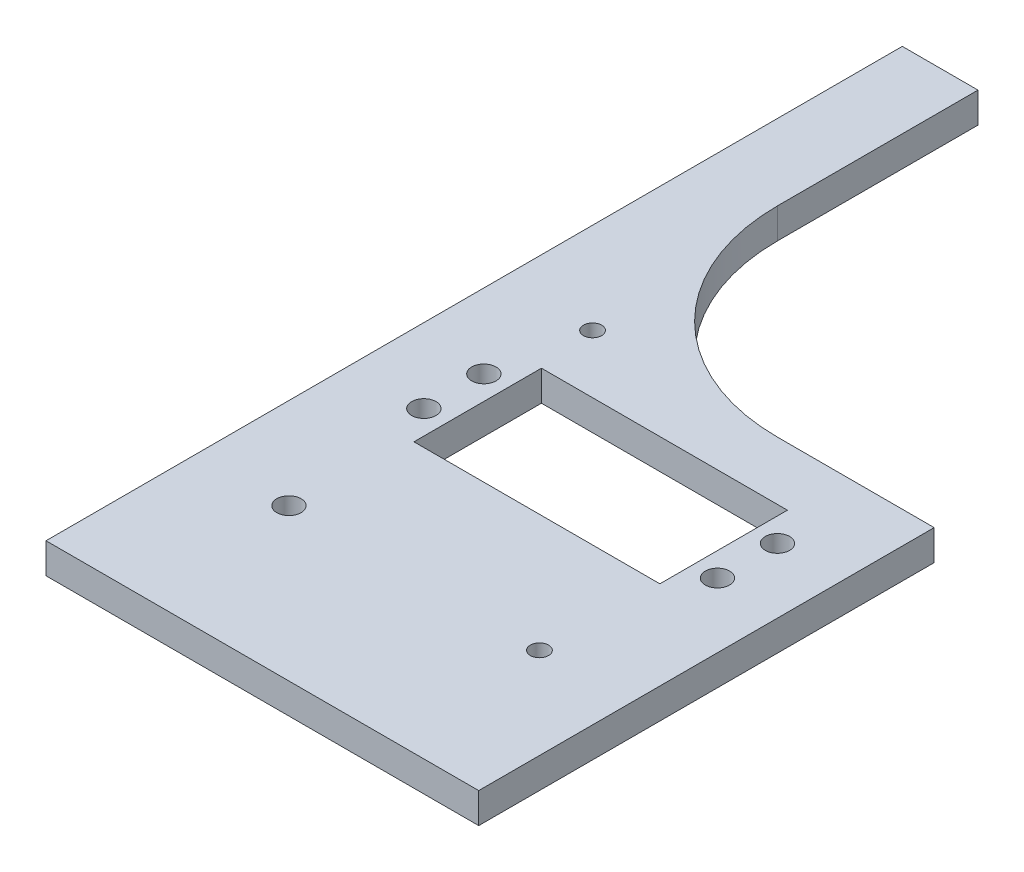
ISO-10303-21;
HEADER;
FILE_DESCRIPTION(('STEP AP214'),'2;1');
FILE_NAME('part.step','',(''),(''),'','','');
FILE_SCHEMA(('AUTOMOTIVE_DESIGN { 1 0 10303 214 1 1 1 1 }'));
ENDSEC;
DATA;
#1=APPLICATION_CONTEXT('core data for automotive mechanical design processes');
#2=APPLICATION_PROTOCOL_DEFINITION('international standard','automotive_design',2000,#1);
#3=PRODUCT_CONTEXT('',#1,'mechanical');
#4=PRODUCT('Part','Part','',(#3));
#5=PRODUCT_RELATED_PRODUCT_CATEGORY('part','',(#4));
#6=PRODUCT_DEFINITION_FORMATION('','',#4);
#7=PRODUCT_DEFINITION_CONTEXT('part definition',#1,'design');
#8=PRODUCT_DEFINITION('design','',#6,#7);
#9=PRODUCT_DEFINITION_SHAPE('','',#8);
#10=(LENGTH_UNIT() NAMED_UNIT(*) SI_UNIT(.MILLI.,.METRE.));
#11=(NAMED_UNIT(*) PLANE_ANGLE_UNIT() SI_UNIT($,.RADIAN.));
#12=(NAMED_UNIT(*) SI_UNIT($,.STERADIAN.) SOLID_ANGLE_UNIT());
#13=UNCERTAINTY_MEASURE_WITH_UNIT(LENGTH_MEASURE(1.E-05),#10,'distance_accuracy_value','');
#14=(GEOMETRIC_REPRESENTATION_CONTEXT(3) GLOBAL_UNCERTAINTY_ASSIGNED_CONTEXT((#13)) GLOBAL_UNIT_ASSIGNED_CONTEXT((#10,
#11,#12)) REPRESENTATION_CONTEXT('',''));
#15=CARTESIAN_POINT('',(0.,0.,0.));
#16=DIRECTION('',(0.,0.,1.));
#17=DIRECTION('',(1.,0.,0.));
#18=AXIS2_PLACEMENT_3D('',#15,#16,#17);
#19=CARTESIAN_POINT('',(0.,2.5,63.6));
#20=DIRECTION('',(0.,0.,1.));
#21=DIRECTION('',(1.,0.,0.));
#22=AXIS2_PLACEMENT_3D('',#19,#20,#21);
#23=PLANE('',#22);
#24=DIRECTION('',(-1.,0.,0.));
#25=VECTOR('',#24,1.);
#26=CARTESIAN_POINT('',(0.,-2.5,63.6));
#27=LINE('',#26,#25);
#28=CARTESIAN_POINT('',(11.216244138034,-2.5,63.6));
#29=VERTEX_POINT('',#28);
#30=CARTESIAN_POINT('',(-29.283755861966,-2.5,63.6));
#31=VERTEX_POINT('',#30);
#32=EDGE_CURVE('E222',#29,#31,#27,.T.);
#33=ORIENTED_EDGE('',*,*,#32,.T.);
#34=DIRECTION('',(0.,-1.,0.));
#35=VECTOR('',#34,1.);
#36=CARTESIAN_POINT('',(-29.283755861966,2.5,63.6));
#37=LINE('',#36,#35);
#38=CARTESIAN_POINT('',(-29.283755861966,2.5,63.6));
#39=VERTEX_POINT('',#38);
#40=EDGE_CURVE('E11',#39,#31,#37,.T.);
#41=ORIENTED_EDGE('',*,*,#40,.F.);
#42=DIRECTION('',(-1.,0.,0.));
#43=VECTOR('',#42,1.);
#44=CARTESIAN_POINT('',(0.,2.5,63.6));
#45=LINE('',#44,#43);
#46=CARTESIAN_POINT('',(11.216244138034,2.5,63.6));
#47=VERTEX_POINT('',#46);
#48=EDGE_CURVE('E155',#47,#39,#45,.T.);
#49=ORIENTED_EDGE('',*,*,#48,.F.);
#50=DIRECTION('',(0.,-1.,0.));
#51=VECTOR('',#50,1.);
#52=CARTESIAN_POINT('',(11.216244138034,2.5,63.6));
#53=LINE('',#52,#51);
#54=EDGE_CURVE('E261',#47,#29,#53,.T.);
#55=ORIENTED_EDGE('',*,*,#54,.T.);
#56=EDGE_LOOP('',(#33,#41,#49,#55));
#57=FACE_BOUND('',#56,.T.);
#58=ADVANCED_FACE('F47',(#57),#23,.F.);
#59=CARTESIAN_POINT('',(-29.283755861966,2.5,0.));
#60=DIRECTION('',(1.,0.,0.));
#61=DIRECTION('',(0.,0.,-1.));
#62=AXIS2_PLACEMENT_3D('',#59,#60,#61);
#63=PLANE('',#62);
#64=DIRECTION('',(0.,0.,1.));
#65=VECTOR('',#64,1.);
#66=CARTESIAN_POINT('',(-29.283755861966,-2.5,0.));
#67=LINE('',#66,#65);
#68=CARTESIAN_POINT('',(-29.283755861966,-2.5,42.6));
#69=VERTEX_POINT('',#68);
#70=EDGE_CURVE('E144',#69,#31,#67,.T.);
#71=ORIENTED_EDGE('',*,*,#70,.F.);
#72=DIRECTION('',(0.,-1.,0.));
#73=VECTOR('',#72,1.);
#74=CARTESIAN_POINT('',(-29.283755861966,2.5,42.6));
#75=LINE('',#74,#73);
#76=CARTESIAN_POINT('',(-29.283755861966,2.5,42.6));
#77=VERTEX_POINT('',#76);
#78=EDGE_CURVE('E58',#77,#69,#75,.T.);
#79=ORIENTED_EDGE('',*,*,#78,.F.);
#80=DIRECTION('',(0.,0.,1.));
#81=VECTOR('',#80,1.);
#82=CARTESIAN_POINT('',(-29.283755861966,2.5,0.));
#83=LINE('',#82,#81);
#84=EDGE_CURVE('E142',#77,#39,#83,.T.);
#85=ORIENTED_EDGE('',*,*,#84,.T.);
#86=ORIENTED_EDGE('',*,*,#40,.T.);
#87=EDGE_LOOP('',(#71,#79,#85,#86));
#88=FACE_BOUND('',#87,.T.);
#89=ADVANCED_FACE('F141',(#88),#63,.T.);
#90=CARTESIAN_POINT('',(0.,2.5,42.6));
#91=DIRECTION('',(0.,0.,1.));
#92=DIRECTION('',(1.,0.,0.));
#93=AXIS2_PLACEMENT_3D('',#90,#91,#92);
#94=PLANE('',#93);
#95=DIRECTION('',(-1.,0.,0.));
#96=VECTOR('',#95,1.);
#97=CARTESIAN_POINT('',(0.,-2.5,42.6));
#98=LINE('',#97,#96);
#99=CARTESIAN_POINT('',(11.216244138034,-2.5,42.6));
#100=VERTEX_POINT('',#99);
#101=EDGE_CURVE('E228',#100,#69,#98,.T.);
#102=ORIENTED_EDGE('',*,*,#101,.F.);
#103=DIRECTION('',(0.,-1.,0.));
#104=VECTOR('',#103,1.);
#105=CARTESIAN_POINT('',(11.216244138034,2.5,42.6));
#106=LINE('',#105,#104);
#107=CARTESIAN_POINT('',(11.216244138034,2.5,42.6));
#108=VERTEX_POINT('',#107);
#109=EDGE_CURVE('E103',#108,#100,#106,.T.);
#110=ORIENTED_EDGE('',*,*,#109,.F.);
#111=DIRECTION('',(-1.,0.,0.));
#112=VECTOR('',#111,1.);
#113=CARTESIAN_POINT('',(0.,2.5,42.6));
#114=LINE('',#113,#112);
#115=EDGE_CURVE('E153',#108,#77,#114,.T.);
#116=ORIENTED_EDGE('',*,*,#115,.T.);
#117=ORIENTED_EDGE('',*,*,#78,.T.);
#118=EDGE_LOOP('',(#102,#110,#116,#117));
#119=FACE_BOUND('',#118,.T.);
#120=ADVANCED_FACE('F159',(#119),#94,.T.);
#121=CARTESIAN_POINT('',(0.,2.5,107.999697870866));
#122=DIRECTION('',(0.,0.,-1.));
#123=DIRECTION('',(-1.,0.,0.));
#124=AXIS2_PLACEMENT_3D('',#121,#122,#123);
#125=PLANE('',#124);
#126=DIRECTION('',(1.,0.,0.));
#127=VECTOR('',#126,1.);
#128=CARTESIAN_POINT('',(0.,-2.5,107.999697870866));
#129=LINE('',#128,#127);
#130=CARTESIAN_POINT('',(-45.4667335164913,-2.5,107.999697870866));
#131=VERTEX_POINT('',#130);
#132=CARTESIAN_POINT('',(25.786244138034,-2.5,107.999697870866));
#133=VERTEX_POINT('',#132);
#134=EDGE_CURVE('E195',#131,#133,#129,.T.);
#135=ORIENTED_EDGE('',*,*,#134,.T.);
#136=DIRECTION('',(0.,-1.,0.));
#137=VECTOR('',#136,1.);
#138=CARTESIAN_POINT('',(25.786244138034,2.5,107.999697870866));
#139=LINE('',#138,#137);
#140=CARTESIAN_POINT('',(25.786244138034,2.5,107.999697870866));
#141=VERTEX_POINT('',#140);
#142=EDGE_CURVE('E51',#141,#133,#139,.T.);
#143=ORIENTED_EDGE('',*,*,#142,.F.);
#144=DIRECTION('',(1.,0.,0.));
#145=VECTOR('',#144,1.);
#146=CARTESIAN_POINT('',(0.,2.5,107.999697870866));
#147=LINE('',#146,#145);
#148=CARTESIAN_POINT('',(-45.4667335164913,2.5,107.999697870866));
#149=VERTEX_POINT('',#148);
#150=EDGE_CURVE('E115',#149,#141,#147,.T.);
#151=ORIENTED_EDGE('',*,*,#150,.F.);
#152=DIRECTION('',(0.,-1.,0.));
#153=VECTOR('',#152,1.);
#154=CARTESIAN_POINT('',(-45.4667335164913,2.5,107.999697870866));
#155=LINE('',#154,#153);
#156=EDGE_CURVE('E194',#149,#131,#155,.T.);
#157=ORIENTED_EDGE('',*,*,#156,.T.);
#158=EDGE_LOOP('',(#135,#143,#151,#157));
#159=FACE_BOUND('',#158,.T.);
#160=ADVANCED_FACE('F49',(#159),#125,.F.);
#161=CARTESIAN_POINT('',(25.786244138034,2.5,0.));
#162=DIRECTION('',(1.,0.,0.));
#163=DIRECTION('',(0.,0.,-1.));
#164=AXIS2_PLACEMENT_3D('',#161,#162,#163);
#165=PLANE('',#164);
#166=DIRECTION('',(0.,0.,1.));
#167=VECTOR('',#166,1.);
#168=CARTESIAN_POINT('',(25.786244138034,-2.5,0.));
#169=LINE('',#168,#167);
#170=CARTESIAN_POINT('',(25.786244138034,-2.5,33.));
#171=VERTEX_POINT('',#170);
#172=EDGE_CURVE('E199',#171,#133,#169,.T.);
#173=ORIENTED_EDGE('',*,*,#172,.F.);
#174=DIRECTION('',(0.,-1.,0.));
#175=VECTOR('',#174,1.);
#176=CARTESIAN_POINT('',(25.786244138034,2.5,33.));
#177=LINE('',#176,#175);
#178=CARTESIAN_POINT('',(25.786244138034,2.5,33.));
#179=VERTEX_POINT('',#178);
#180=EDGE_CURVE('E280',#179,#171,#177,.T.);
#181=ORIENTED_EDGE('',*,*,#180,.F.);
#182=DIRECTION('',(0.,0.,1.));
#183=VECTOR('',#182,1.);
#184=CARTESIAN_POINT('',(25.786244138034,2.5,0.));
#185=LINE('',#184,#183);
#186=EDGE_CURVE('E290',#179,#141,#185,.T.);
#187=ORIENTED_EDGE('',*,*,#186,.T.);
#188=ORIENTED_EDGE('',*,*,#142,.T.);
#189=EDGE_LOOP('',(#173,#181,#187,#188));
#190=FACE_BOUND('',#189,.T.);
#191=ADVANCED_FACE('F289',(#190),#165,.T.);
#192=CARTESIAN_POINT('',(0.,2.5,33.));
#193=DIRECTION('',(0.,0.,-1.));
#194=DIRECTION('',(-1.,0.,0.));
#195=AXIS2_PLACEMENT_3D('',#192,#193,#194);
#196=PLANE('',#195);
#197=DIRECTION('',(1.,0.,0.));
#198=VECTOR('',#197,1.);
#199=CARTESIAN_POINT('',(0.,-2.5,33.));
#200=LINE('',#199,#198);
#201=CARTESIAN_POINT('',(0.,-2.5,33.));
#202=VERTEX_POINT('',#201);
#203=EDGE_CURVE('E203',#202,#171,#200,.T.);
#204=ORIENTED_EDGE('',*,*,#203,.F.);
#205=DIRECTION('',(0.,-1.,0.));
#206=VECTOR('',#205,1.);
#207=CARTESIAN_POINT('',(0.,2.5,33.));
#208=LINE('',#207,#206);
#209=CARTESIAN_POINT('',(0.,2.5,33.));
#210=VERTEX_POINT('',#209);
#211=EDGE_CURVE('E278',#210,#202,#208,.T.);
#212=ORIENTED_EDGE('',*,*,#211,.F.);
#213=DIRECTION('',(1.,0.,0.));
#214=VECTOR('',#213,1.);
#215=CARTESIAN_POINT('',(0.,2.5,33.));
#216=LINE('',#215,#214);
#217=EDGE_CURVE('E301',#210,#179,#216,.T.);
#218=ORIENTED_EDGE('',*,*,#217,.T.);
#219=ORIENTED_EDGE('',*,*,#180,.T.);
#220=EDGE_LOOP('',(#204,#212,#218,#219));
#221=FACE_BOUND('',#220,.T.);
#222=ADVANCED_FACE('F299',(#221),#196,.T.);
#223=CARTESIAN_POINT('',(0.,2.5,0.));
#224=DIRECTION('',(0.,-1.,0.));
#225=DIRECTION('',(0.,0.,-1.));
#226=AXIS2_PLACEMENT_3D('',#223,#224,#225);
#227=CYLINDRICAL_SURFACE('',#226,33.);
#228=CARTESIAN_POINT('',(0.,-2.5,0.));
#229=DIRECTION('',(0.,1.,0.));
#230=DIRECTION('',(0.,0.,1.));
#231=AXIS2_PLACEMENT_3D('',#228,#229,#230);
#232=CIRCLE('',#231,33.);
#233=CARTESIAN_POINT('',(-33.,-2.5,0.));
#234=VERTEX_POINT('',#233);
#235=EDGE_CURVE('E207',#234,#202,#232,.T.);
#236=ORIENTED_EDGE('',*,*,#235,.F.);
#237=DIRECTION('',(0.,-1.,0.));
#238=VECTOR('',#237,1.);
#239=CARTESIAN_POINT('',(-33.,2.5,0.));
#240=LINE('',#239,#238);
#241=CARTESIAN_POINT('',(-33.,2.5,0.));
#242=VERTEX_POINT('',#241);
#243=EDGE_CURVE('E275',#242,#234,#240,.T.);
#244=ORIENTED_EDGE('',*,*,#243,.F.);
#245=CARTESIAN_POINT('',(0.,2.5,0.));
#246=DIRECTION('',(0.,1.,0.));
#247=DIRECTION('',(0.,0.,1.));
#248=AXIS2_PLACEMENT_3D('',#245,#246,#247);
#249=CIRCLE('',#248,33.);
#250=EDGE_CURVE('E305',#242,#210,#249,.T.);
#251=ORIENTED_EDGE('',*,*,#250,.T.);
#252=ORIENTED_EDGE('',*,*,#211,.T.);
#253=EDGE_LOOP('',(#236,#244,#251,#252));
#254=FACE_BOUND('',#253,.T.);
#255=ADVANCED_FACE('F308',(#254),#227,.F.);
#256=CARTESIAN_POINT('',(-33.,2.5,0.));
#257=DIRECTION('',(-1.,0.,0.));
#258=DIRECTION('',(0.,0.,1.));
#259=AXIS2_PLACEMENT_3D('',#256,#257,#258);
#260=PLANE('',#259);
#261=DIRECTION('',(0.,0.,-1.));
#262=VECTOR('',#261,1.);
#263=CARTESIAN_POINT('',(-33.,-2.5,0.));
#264=LINE('',#263,#262);
#265=CARTESIAN_POINT('',(-33.,-2.5,-33.));
#266=VERTEX_POINT('',#265);
#267=EDGE_CURVE('E211',#234,#266,#264,.T.);
#268=ORIENTED_EDGE('',*,*,#267,.T.);
#269=DIRECTION('',(0.,-1.,0.));
#270=VECTOR('',#269,1.);
#271=CARTESIAN_POINT('',(-33.,2.5,-33.));
#272=LINE('',#271,#270);
#273=CARTESIAN_POINT('',(-33.,2.5,-33.));
#274=VERTEX_POINT('',#273);
#275=EDGE_CURVE('E271',#274,#266,#272,.T.);
#276=ORIENTED_EDGE('',*,*,#275,.F.);
#277=DIRECTION('',(0.,0.,-1.));
#278=VECTOR('',#277,1.);
#279=CARTESIAN_POINT('',(-33.,2.5,0.));
#280=LINE('',#279,#278);
#281=EDGE_CURVE('E311',#242,#274,#280,.T.);
#282=ORIENTED_EDGE('',*,*,#281,.F.);
#283=ORIENTED_EDGE('',*,*,#243,.T.);
#284=EDGE_LOOP('',(#268,#276,#282,#283));
#285=FACE_BOUND('',#284,.T.);
#286=ADVANCED_FACE('F333',(#285),#260,.F.);
#287=CARTESIAN_POINT('',(0.,2.5,-33.));
#288=DIRECTION('',(0.,0.,1.));
#289=DIRECTION('',(1.,0.,0.));
#290=AXIS2_PLACEMENT_3D('',#287,#288,#289);
#291=PLANE('',#290);
#292=DIRECTION('',(-1.,0.,0.));
#293=VECTOR('',#292,1.);
#294=CARTESIAN_POINT('',(0.,-2.5,-33.));
#295=LINE('',#294,#293);
#296=CARTESIAN_POINT('',(-45.4667335164913,-2.5,-33.));
#297=VERTEX_POINT('',#296);
#298=EDGE_CURVE('E214',#266,#297,#295,.T.);
#299=ORIENTED_EDGE('',*,*,#298,.T.);
#300=DIRECTION('',(0.,-1.,0.));
#301=VECTOR('',#300,1.);
#302=CARTESIAN_POINT('',(-45.4667335164913,2.5,-33.));
#303=LINE('',#302,#301);
#304=CARTESIAN_POINT('',(-45.4667335164913,2.5,-33.));
#305=VERTEX_POINT('',#304);
#306=EDGE_CURVE('E268',#305,#297,#303,.T.);
#307=ORIENTED_EDGE('',*,*,#306,.F.);
#308=DIRECTION('',(-1.,0.,0.));
#309=VECTOR('',#308,1.);
#310=CARTESIAN_POINT('',(0.,2.5,-33.));
#311=LINE('',#310,#309);
#312=EDGE_CURVE('E314',#274,#305,#311,.T.);
#313=ORIENTED_EDGE('',*,*,#312,.F.);
#314=ORIENTED_EDGE('',*,*,#275,.T.);
#315=EDGE_LOOP('',(#299,#307,#313,#314));
#316=FACE_BOUND('',#315,.T.);
#317=ADVANCED_FACE('F330',(#316),#291,.F.);
#318=CARTESIAN_POINT('',(15.136244138034,2.5,48.16));
#319=DIRECTION('',(0.,-1.,0.));
#320=DIRECTION('',(0.,0.,-1.));
#321=AXIS2_PLACEMENT_3D('',#318,#319,#320);
#322=CYLINDRICAL_SURFACE('',#321,2.00000000000001);
#323=CARTESIAN_POINT('',(15.136244138034,2.5,48.16));
#324=DIRECTION('',(0.,1.,0.));
#325=DIRECTION('',(0.,0.,1.));
#326=AXIS2_PLACEMENT_3D('',#323,#324,#325);
#327=CIRCLE('',#326,2.00000000000001);
#328=CARTESIAN_POINT('',(15.136244138034,2.5,50.16));
#329=VERTEX_POINT('',#328);
#330=EDGE_CURVE('E186',#329,#329,#327,.T.);
#331=ORIENTED_EDGE('',*,*,#330,.T.);
#332=EDGE_LOOP('',(#331));
#333=FACE_BOUND('',#332,.T.);
#334=CARTESIAN_POINT('',(15.136244138034,-2.5,48.16));
#335=DIRECTION('',(0.,1.,0.));
#336=DIRECTION('',(0.,0.,1.));
#337=AXIS2_PLACEMENT_3D('',#334,#335,#336);
#338=CIRCLE('',#337,2.00000000000001);
#339=CARTESIAN_POINT('',(15.136244138034,-2.5,50.16));
#340=VERTEX_POINT('',#339);
#341=EDGE_CURVE('E253',#340,#340,#338,.T.);
#342=ORIENTED_EDGE('',*,*,#341,.F.);
#343=EDGE_LOOP('',(#342));
#344=FACE_BOUND('',#343,.T.);
#345=ADVANCED_FACE('F340',(#333,#344),#322,.F.);
#346=CARTESIAN_POINT('',(15.136244138034,2.5,58.04));
#347=DIRECTION('',(0.,-1.,0.));
#348=DIRECTION('',(0.,0.,-1.));
#349=AXIS2_PLACEMENT_3D('',#346,#347,#348);
#350=CYLINDRICAL_SURFACE('',#349,2.);
#351=CARTESIAN_POINT('',(15.136244138034,2.5,58.04));
#352=DIRECTION('',(0.,1.,0.));
#353=DIRECTION('',(0.,0.,1.));
#354=AXIS2_PLACEMENT_3D('',#351,#352,#353);
#355=CIRCLE('',#354,2.);
#356=CARTESIAN_POINT('',(15.136244138034,2.5,60.04));
#357=VERTEX_POINT('',#356);
#358=EDGE_CURVE('E182',#357,#357,#355,.T.);
#359=ORIENTED_EDGE('',*,*,#358,.T.);
#360=EDGE_LOOP('',(#359));
#361=FACE_BOUND('',#360,.T.);
#362=CARTESIAN_POINT('',(15.136244138034,-2.5,58.04));
#363=DIRECTION('',(0.,1.,0.));
#364=DIRECTION('',(0.,0.,1.));
#365=AXIS2_PLACEMENT_3D('',#362,#363,#364);
#366=CIRCLE('',#365,2.);
#367=CARTESIAN_POINT('',(15.136244138034,-2.5,60.04));
#368=VERTEX_POINT('',#367);
#369=EDGE_CURVE('E249',#368,#368,#366,.T.);
#370=ORIENTED_EDGE('',*,*,#369,.F.);
#371=EDGE_LOOP('',(#370));
#372=FACE_BOUND('',#371,.T.);
#373=ADVANCED_FACE('F409',(#361,#372),#350,.F.);
#374=CARTESIAN_POINT('',(10.786244138034,2.5,83.));
#375=DIRECTION('',(0.,-1.,0.));
#376=DIRECTION('',(0.,0.,-1.));
#377=AXIS2_PLACEMENT_3D('',#374,#375,#376);
#378=CYLINDRICAL_SURFACE('',#377,1.5);
#379=CARTESIAN_POINT('',(10.786244138034,2.5,83.));
#380=DIRECTION('',(0.,1.,0.));
#381=DIRECTION('',(0.,0.,1.));
#382=AXIS2_PLACEMENT_3D('',#379,#380,#381);
#383=CIRCLE('',#382,1.5);
#384=CARTESIAN_POINT('',(10.786244138034,2.5,84.5));
#385=VERTEX_POINT('',#384);
#386=EDGE_CURVE('E178',#385,#385,#383,.T.);
#387=ORIENTED_EDGE('',*,*,#386,.T.);
#388=EDGE_LOOP('',(#387));
#389=FACE_BOUND('',#388,.T.);
#390=CARTESIAN_POINT('',(10.786244138034,-2.5,83.));
#391=DIRECTION('',(0.,1.,0.));
#392=DIRECTION('',(0.,0.,1.));
#393=AXIS2_PLACEMENT_3D('',#390,#391,#392);
#394=CIRCLE('',#393,1.5);
#395=CARTESIAN_POINT('',(10.786244138034,-2.5,84.5));
#396=VERTEX_POINT('',#395);
#397=EDGE_CURVE('E245',#396,#396,#394,.T.);
#398=ORIENTED_EDGE('',*,*,#397,.F.);
#399=EDGE_LOOP('',(#398));
#400=FACE_BOUND('',#399,.T.);
#401=ADVANCED_FACE('F420',(#389,#400),#378,.F.);
#402=CARTESIAN_POINT('',(-30.463755861966,2.5,83.));
#403=DIRECTION('',(0.,-1.,0.));
#404=DIRECTION('',(0.,0.,-1.));
#405=AXIS2_PLACEMENT_3D('',#402,#403,#404);
#406=CYLINDRICAL_SURFACE('',#405,2.);
#407=CARTESIAN_POINT('',(-30.463755861966,2.5,83.));
#408=DIRECTION('',(0.,1.,0.));
#409=DIRECTION('',(0.,0.,1.));
#410=AXIS2_PLACEMENT_3D('',#407,#408,#409);
#411=CIRCLE('',#410,2.);
#412=CARTESIAN_POINT('',(-30.463755861966,2.5,85.));
#413=VERTEX_POINT('',#412);
#414=EDGE_CURVE('E174',#413,#413,#411,.T.);
#415=ORIENTED_EDGE('',*,*,#414,.T.);
#416=EDGE_LOOP('',(#415));
#417=FACE_BOUND('',#416,.T.);
#418=CARTESIAN_POINT('',(-30.463755861966,-2.5,83.));
#419=DIRECTION('',(0.,1.,0.));
#420=DIRECTION('',(0.,0.,1.));
#421=AXIS2_PLACEMENT_3D('',#418,#419,#420);
#422=CIRCLE('',#421,2.);
#423=CARTESIAN_POINT('',(-30.463755861966,-2.5,85.));
#424=VERTEX_POINT('',#423);
#425=EDGE_CURVE('E241',#424,#424,#422,.T.);
#426=ORIENTED_EDGE('',*,*,#425,.F.);
#427=EDGE_LOOP('',(#426));
#428=FACE_BOUND('',#427,.T.);
#429=ADVANCED_FACE('F431',(#417,#428),#406,.F.);
#430=CARTESIAN_POINT('',(-30.4667335164913,2.5,33.));
#431=DIRECTION('',(0.,-1.,0.));
#432=DIRECTION('',(0.,0.,-1.));
#433=AXIS2_PLACEMENT_3D('',#430,#431,#432);
#434=CYLINDRICAL_SURFACE('',#433,1.5);
#435=CARTESIAN_POINT('',(-30.4667335164913,2.5,33.));
#436=DIRECTION('',(0.,1.,0.));
#437=DIRECTION('',(0.,0.,1.));
#438=AXIS2_PLACEMENT_3D('',#435,#436,#437);
#439=CIRCLE('',#438,1.5);
#440=CARTESIAN_POINT('',(-30.4667335164913,2.5,34.5));
#441=VERTEX_POINT('',#440);
#442=EDGE_CURVE('E170',#441,#441,#439,.T.);
#443=ORIENTED_EDGE('',*,*,#442,.T.);
#444=EDGE_LOOP('',(#443));
#445=FACE_BOUND('',#444,.T.);
#446=CARTESIAN_POINT('',(-30.4667335164913,-2.5,33.));
#447=DIRECTION('',(0.,1.,0.));
#448=DIRECTION('',(0.,0.,1.));
#449=AXIS2_PLACEMENT_3D('',#446,#447,#448);
#450=CIRCLE('',#449,1.5);
#451=CARTESIAN_POINT('',(-30.4667335164913,-2.5,34.5));
#452=VERTEX_POINT('',#451);
#453=EDGE_CURVE('E237',#452,#452,#450,.T.);
#454=ORIENTED_EDGE('',*,*,#453,.F.);
#455=EDGE_LOOP('',(#454));
#456=FACE_BOUND('',#455,.T.);
#457=ADVANCED_FACE('F366',(#445,#456),#434,.F.);
#458=CARTESIAN_POINT('',(-33.2067335164913,2.5,48.16));
#459=DIRECTION('',(0.,-1.,0.));
#460=DIRECTION('',(0.,0.,-1.));
#461=AXIS2_PLACEMENT_3D('',#458,#459,#460);
#462=CYLINDRICAL_SURFACE('',#461,2.);
#463=CARTESIAN_POINT('',(-33.2067335164913,2.5,48.16));
#464=DIRECTION('',(0.,1.,0.));
#465=DIRECTION('',(0.,0.,1.));
#466=AXIS2_PLACEMENT_3D('',#463,#464,#465);
#467=CIRCLE('',#466,2.);
#468=CARTESIAN_POINT('',(-33.2067335164913,2.5,50.16));
#469=VERTEX_POINT('',#468);
#470=EDGE_CURVE('E163',#469,#469,#467,.T.);
#471=ORIENTED_EDGE('',*,*,#470,.T.);
#472=EDGE_LOOP('',(#471));
#473=FACE_BOUND('',#472,.T.);
#474=CARTESIAN_POINT('',(-33.2067335164913,-2.5,48.16));
#475=DIRECTION('',(0.,1.,0.));
#476=DIRECTION('',(0.,0.,1.));
#477=AXIS2_PLACEMENT_3D('',#474,#475,#476);
#478=CIRCLE('',#477,2.);
#479=CARTESIAN_POINT('',(-33.2067335164913,-2.5,50.16));
#480=VERTEX_POINT('',#479);
#481=EDGE_CURVE('E233',#480,#480,#478,.T.);
#482=ORIENTED_EDGE('',*,*,#481,.F.);
#483=EDGE_LOOP('',(#482));
#484=FACE_BOUND('',#483,.T.);
#485=ADVANCED_FACE('F361',(#473,#484),#462,.F.);
#486=CARTESIAN_POINT('',(11.216244138034,2.5,0.));
#487=DIRECTION('',(1.,0.,0.));
#488=DIRECTION('',(0.,0.,-1.));
#489=AXIS2_PLACEMENT_3D('',#486,#487,#488);
#490=PLANE('',#489);
#491=DIRECTION('',(0.,0.,1.));
#492=VECTOR('',#491,1.);
#493=CARTESIAN_POINT('',(11.216244138034,-2.5,0.));
#494=LINE('',#493,#492);
#495=EDGE_CURVE('E106',#100,#29,#494,.T.);
#496=ORIENTED_EDGE('',*,*,#495,.T.);
#497=ORIENTED_EDGE('',*,*,#54,.F.);
#498=DIRECTION('',(0.,0.,1.));
#499=VECTOR('',#498,1.);
#500=CARTESIAN_POINT('',(11.216244138034,2.5,0.));
#501=LINE('',#500,#499);
#502=EDGE_CURVE('E67',#108,#47,#501,.T.);
#503=ORIENTED_EDGE('',*,*,#502,.F.);
#504=ORIENTED_EDGE('',*,*,#109,.T.);
#505=EDGE_LOOP('',(#496,#497,#503,#504));
#506=FACE_BOUND('',#505,.T.);
#507=ADVANCED_FACE('F354',(#506),#490,.F.);
#508=CARTESIAN_POINT('',(-45.4667335164913,2.5,0.));
#509=DIRECTION('',(-1.,0.,0.));
#510=DIRECTION('',(0.,0.,1.));
#511=AXIS2_PLACEMENT_3D('',#508,#509,#510);
#512=PLANE('',#511);
#513=DIRECTION('',(0.,0.,-1.));
#514=VECTOR('',#513,1.);
#515=CARTESIAN_POINT('',(-45.4667335164913,-2.5,0.));
#516=LINE('',#515,#514);
#517=EDGE_CURVE('E218',#131,#297,#516,.T.);
#518=ORIENTED_EDGE('',*,*,#517,.F.);
#519=ORIENTED_EDGE('',*,*,#156,.F.);
#520=DIRECTION('',(0.,0.,-1.));
#521=VECTOR('',#520,1.);
#522=CARTESIAN_POINT('',(-45.4667335164913,2.5,0.));
#523=LINE('',#522,#521);
#524=EDGE_CURVE('E320',#149,#305,#523,.T.);
#525=ORIENTED_EDGE('',*,*,#524,.T.);
#526=ORIENTED_EDGE('',*,*,#306,.T.);
#527=EDGE_LOOP('',(#518,#519,#525,#526));
#528=FACE_BOUND('',#527,.T.);
#529=ADVANCED_FACE('F325',(#528),#512,.T.);
#530=CARTESIAN_POINT('',(-33.2067335164913,2.5,58.04));
#531=DIRECTION('',(0.,-1.,0.));
#532=DIRECTION('',(0.,0.,-1.));
#533=AXIS2_PLACEMENT_3D('',#530,#531,#532);
#534=CYLINDRICAL_SURFACE('',#533,2.);
#535=CARTESIAN_POINT('',(-33.2067335164913,2.5,58.04));
#536=DIRECTION('',(0.,1.,0.));
#537=DIRECTION('',(0.,0.,1.));
#538=AXIS2_PLACEMENT_3D('',#535,#536,#537);
#539=CIRCLE('',#538,2.);
#540=CARTESIAN_POINT('',(-33.2067335164913,2.5,60.04));
#541=VERTEX_POINT('',#540);
#542=EDGE_CURVE('E190',#541,#541,#539,.T.);
#543=ORIENTED_EDGE('',*,*,#542,.T.);
#544=EDGE_LOOP('',(#543));
#545=FACE_BOUND('',#544,.T.);
#546=CARTESIAN_POINT('',(-33.2067335164913,-2.5,58.04));
#547=DIRECTION('',(0.,1.,0.));
#548=DIRECTION('',(0.,0.,1.));
#549=AXIS2_PLACEMENT_3D('',#546,#547,#548);
#550=CIRCLE('',#549,2.);
#551=CARTESIAN_POINT('',(-33.2067335164913,-2.5,60.04));
#552=VERTEX_POINT('',#551);
#553=EDGE_CURVE('E257',#552,#552,#550,.T.);
#554=ORIENTED_EDGE('',*,*,#553,.F.);
#555=EDGE_LOOP('',(#554));
#556=FACE_BOUND('',#555,.T.);
#557=ADVANCED_FACE('F353',(#545,#556),#534,.F.);
#558=CARTESIAN_POINT('',(0.,2.5,0.));
#559=DIRECTION('',(0.,1.,0.));
#560=DIRECTION('',(0.,0.,1.));
#561=AXIS2_PLACEMENT_3D('',#558,#559,#560);
#562=PLANE('',#561);
#563=ORIENTED_EDGE('',*,*,#150,.T.);
#564=ORIENTED_EDGE('',*,*,#186,.F.);
#565=ORIENTED_EDGE('',*,*,#217,.F.);
#566=ORIENTED_EDGE('',*,*,#250,.F.);
#567=ORIENTED_EDGE('',*,*,#281,.T.);
#568=ORIENTED_EDGE('',*,*,#312,.T.);
#569=ORIENTED_EDGE('',*,*,#524,.F.);
#570=EDGE_LOOP('',(#563,#564,#565,#566,#567,#568,#569));
#571=FACE_BOUND('',#570,.T.);
#572=ORIENTED_EDGE('',*,*,#48,.T.);
#573=ORIENTED_EDGE('',*,*,#84,.F.);
#574=ORIENTED_EDGE('',*,*,#115,.F.);
#575=ORIENTED_EDGE('',*,*,#502,.T.);
#576=EDGE_LOOP('',(#572,#573,#574,#575));
#577=FACE_BOUND('',#576,.T.);
#578=ORIENTED_EDGE('',*,*,#470,.F.);
#579=EDGE_LOOP('',(#578));
#580=FACE_BOUND('',#579,.T.);
#581=ORIENTED_EDGE('',*,*,#442,.F.);
#582=EDGE_LOOP('',(#581));
#583=FACE_BOUND('',#582,.T.);
#584=ORIENTED_EDGE('',*,*,#414,.F.);
#585=EDGE_LOOP('',(#584));
#586=FACE_BOUND('',#585,.T.);
#587=ORIENTED_EDGE('',*,*,#386,.F.);
#588=EDGE_LOOP('',(#587));
#589=FACE_BOUND('',#588,.T.);
#590=ORIENTED_EDGE('',*,*,#358,.F.);
#591=EDGE_LOOP('',(#590));
#592=FACE_BOUND('',#591,.T.);
#593=ORIENTED_EDGE('',*,*,#330,.F.);
#594=EDGE_LOOP('',(#593));
#595=FACE_BOUND('',#594,.T.);
#596=ORIENTED_EDGE('',*,*,#542,.F.);
#597=EDGE_LOOP('',(#596));
#598=FACE_BOUND('',#597,.T.);
#599=ADVANCED_FACE('F151',(#571,#577,#580,#583,#586,#589,#592,#595,#598),#562,.T.);
#600=CARTESIAN_POINT('',(0.,-2.5,0.));
#601=DIRECTION('',(0.,1.,0.));
#602=DIRECTION('',(0.,0.,1.));
#603=AXIS2_PLACEMENT_3D('',#600,#601,#602);
#604=PLANE('',#603);
#605=ORIENTED_EDGE('',*,*,#134,.F.);
#606=ORIENTED_EDGE('',*,*,#517,.T.);
#607=ORIENTED_EDGE('',*,*,#298,.F.);
#608=ORIENTED_EDGE('',*,*,#267,.F.);
#609=ORIENTED_EDGE('',*,*,#235,.T.);
#610=ORIENTED_EDGE('',*,*,#203,.T.);
#611=ORIENTED_EDGE('',*,*,#172,.T.);
#612=EDGE_LOOP('',(#605,#606,#607,#608,#609,#610,#611));
#613=FACE_BOUND('',#612,.T.);
#614=ORIENTED_EDGE('',*,*,#32,.F.);
#615=ORIENTED_EDGE('',*,*,#495,.F.);
#616=ORIENTED_EDGE('',*,*,#101,.T.);
#617=ORIENTED_EDGE('',*,*,#70,.T.);
#618=EDGE_LOOP('',(#614,#615,#616,#617));
#619=FACE_BOUND('',#618,.T.);
#620=ORIENTED_EDGE('',*,*,#481,.T.);
#621=EDGE_LOOP('',(#620));
#622=FACE_BOUND('',#621,.T.);
#623=ORIENTED_EDGE('',*,*,#453,.T.);
#624=EDGE_LOOP('',(#623));
#625=FACE_BOUND('',#624,.T.);
#626=ORIENTED_EDGE('',*,*,#425,.T.);
#627=EDGE_LOOP('',(#626));
#628=FACE_BOUND('',#627,.T.);
#629=ORIENTED_EDGE('',*,*,#397,.T.);
#630=EDGE_LOOP('',(#629));
#631=FACE_BOUND('',#630,.T.);
#632=ORIENTED_EDGE('',*,*,#369,.T.);
#633=EDGE_LOOP('',(#632));
#634=FACE_BOUND('',#633,.T.);
#635=ORIENTED_EDGE('',*,*,#341,.T.);
#636=EDGE_LOOP('',(#635));
#637=FACE_BOUND('',#636,.T.);
#638=ORIENTED_EDGE('',*,*,#553,.T.);
#639=EDGE_LOOP('',(#638));
#640=FACE_BOUND('',#639,.T.);
#641=ADVANCED_FACE('F295',(#613,#619,#622,#625,#628,#631,#634,#637,#640),#604,.F.);
#642=CLOSED_SHELL('',(#58,#89,#120,#160,#191,#222,#255,#286,#317,#345,#373,#401,#429,#457,#485,
#507,#529,#557,#599,#641));
#643=MANIFOLD_SOLID_BREP('B2',#642);
#644=ADVANCED_BREP_SHAPE_REPRESENTATION('',(#18,#643),#14);
#645=SHAPE_DEFINITION_REPRESENTATION(#9,#644);
ENDSEC;
END-ISO-10303-21;
